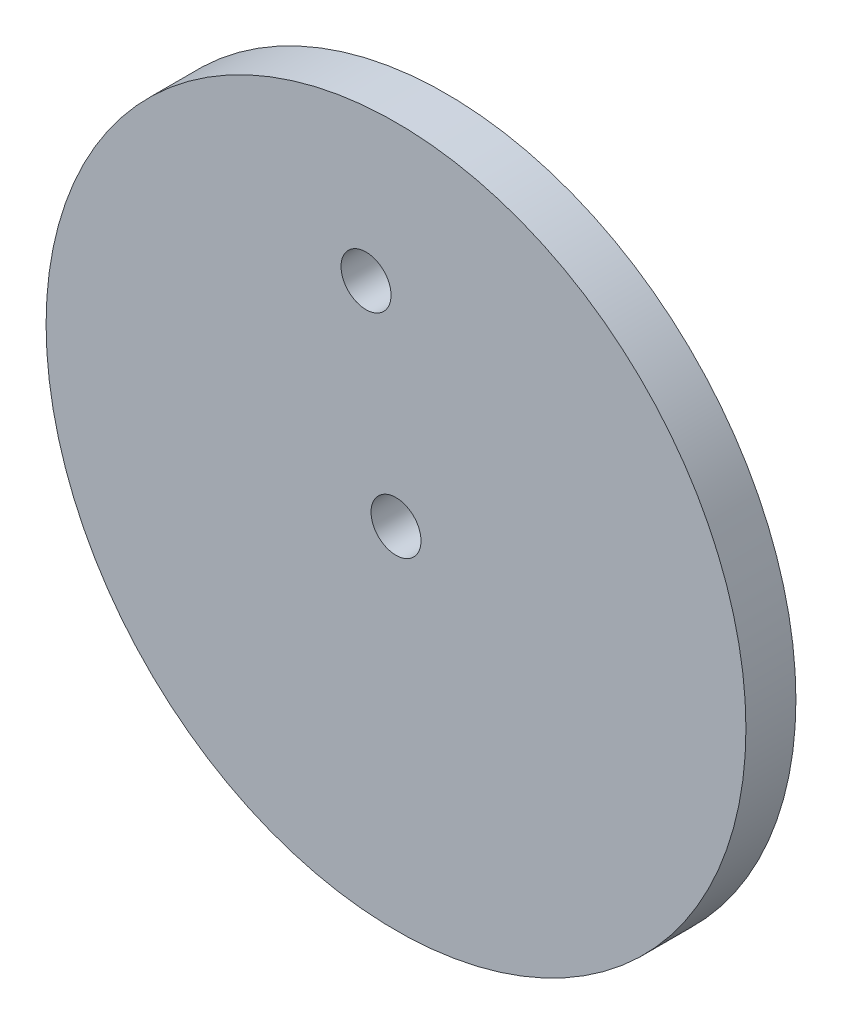
ISO-10303-21;
HEADER;
FILE_DESCRIPTION(('STEP AP214'),'2;1');
FILE_NAME('part.step','',(''),(''),'','','');
FILE_SCHEMA(('AUTOMOTIVE_DESIGN { 1 0 10303 214 1 1 1 1 }'));
ENDSEC;
DATA;
#1=APPLICATION_CONTEXT('core data for automotive mechanical design processes');
#2=APPLICATION_PROTOCOL_DEFINITION('international standard','automotive_design',2000,#1);
#3=PRODUCT_CONTEXT('',#1,'mechanical');
#4=PRODUCT('Part','Part','',(#3));
#5=PRODUCT_RELATED_PRODUCT_CATEGORY('part','',(#4));
#6=PRODUCT_DEFINITION_FORMATION('','',#4);
#7=PRODUCT_DEFINITION_CONTEXT('part definition',#1,'design');
#8=PRODUCT_DEFINITION('design','',#6,#7);
#9=PRODUCT_DEFINITION_SHAPE('','',#8);
#10=(LENGTH_UNIT() NAMED_UNIT(*) SI_UNIT(.MILLI.,.METRE.));
#11=(NAMED_UNIT(*) PLANE_ANGLE_UNIT() SI_UNIT($,.RADIAN.));
#12=(NAMED_UNIT(*) SI_UNIT($,.STERADIAN.) SOLID_ANGLE_UNIT());
#13=UNCERTAINTY_MEASURE_WITH_UNIT(LENGTH_MEASURE(1.E-05),#10,'distance_accuracy_value','');
#14=(GEOMETRIC_REPRESENTATION_CONTEXT(3) GLOBAL_UNCERTAINTY_ASSIGNED_CONTEXT((#13)) GLOBAL_UNIT_ASSIGNED_CONTEXT((#10,
#11,#12)) REPRESENTATION_CONTEXT('',''));
#15=CARTESIAN_POINT('',(0.,0.,0.));
#16=DIRECTION('',(0.,0.,1.));
#17=DIRECTION('',(1.,0.,0.));
#18=AXIS2_PLACEMENT_3D('',#15,#16,#17);
#19=CARTESIAN_POINT('',(0.,0.,3.175));
#20=DIRECTION('',(0.,0.,1.));
#21=DIRECTION('',(1.,0.,0.));
#22=AXIS2_PLACEMENT_3D('',#19,#20,#21);
#23=PLANE('',#22);
#24=CARTESIAN_POINT('',(0.,0.,3.175));
#25=DIRECTION('',(0.,0.,1.));
#26=DIRECTION('',(1.,0.,0.));
#27=AXIS2_PLACEMENT_3D('',#24,#25,#26);
#28=CIRCLE('',#27,1.5875);
#29=CARTESIAN_POINT('',(1.5875,0.,3.175));
#30=VERTEX_POINT('',#29);
#31=EDGE_CURVE('E44',#30,#30,#28,.T.);
#32=ORIENTED_EDGE('',*,*,#31,.F.);
#33=EDGE_LOOP('',(#32));
#34=FACE_BOUND('',#33,.T.);
#35=CARTESIAN_POINT('',(0.,0.,3.175));
#36=DIRECTION('',(0.,0.,1.));
#37=DIRECTION('',(1.,0.,0.));
#38=AXIS2_PLACEMENT_3D('',#35,#36,#37);
#39=CIRCLE('',#38,22.225);
#40=CARTESIAN_POINT('',(22.225,0.,3.175));
#41=VERTEX_POINT('',#40);
#42=EDGE_CURVE('E10',#41,#41,#39,.T.);
#43=ORIENTED_EDGE('',*,*,#42,.T.);
#44=EDGE_LOOP('',(#43));
#45=FACE_BOUND('',#44,.T.);
#46=CARTESIAN_POINT('',(-1.90394247561181,12.5564725559992,3.175));
#47=DIRECTION('',(0.,0.,1.));
#48=DIRECTION('',(1.,0.,0.));
#49=AXIS2_PLACEMENT_3D('',#46,#47,#48);
#50=CIRCLE('',#49,1.5875);
#51=CARTESIAN_POINT('',(-0.316442475611814,12.5564725559992,3.175));
#52=VERTEX_POINT('',#51);
#53=EDGE_CURVE('E49',#52,#52,#50,.T.);
#54=ORIENTED_EDGE('',*,*,#53,.F.);
#55=EDGE_LOOP('',(#54));
#56=FACE_BOUND('',#55,.T.);
#57=ADVANCED_FACE('F33',(#34,#45,#56),#23,.T.);
#58=CARTESIAN_POINT('',(0.,0.,0.));
#59=DIRECTION('',(0.,0.,1.));
#60=DIRECTION('',(1.,0.,0.));
#61=AXIS2_PLACEMENT_3D('',#58,#59,#60);
#62=PLANE('',#61);
#63=CARTESIAN_POINT('',(0.,0.,0.));
#64=DIRECTION('',(0.,0.,1.));
#65=DIRECTION('',(1.,0.,0.));
#66=AXIS2_PLACEMENT_3D('',#63,#64,#65);
#67=CIRCLE('',#66,22.225);
#68=CARTESIAN_POINT('',(22.225,0.,0.));
#69=VERTEX_POINT('',#68);
#70=EDGE_CURVE('E37',#69,#69,#67,.T.);
#71=ORIENTED_EDGE('',*,*,#70,.F.);
#72=EDGE_LOOP('',(#71));
#73=FACE_BOUND('',#72,.T.);
#74=CARTESIAN_POINT('',(0.,0.,0.));
#75=DIRECTION('',(0.,0.,1.));
#76=DIRECTION('',(1.,0.,0.));
#77=AXIS2_PLACEMENT_3D('',#74,#75,#76);
#78=CIRCLE('',#77,1.5875);
#79=CARTESIAN_POINT('',(1.5875,0.,0.));
#80=VERTEX_POINT('',#79);
#81=EDGE_CURVE('E46',#80,#80,#78,.T.);
#82=ORIENTED_EDGE('',*,*,#81,.T.);
#83=EDGE_LOOP('',(#82));
#84=FACE_BOUND('',#83,.T.);
#85=CARTESIAN_POINT('',(-1.90394247561181,12.5564725559992,0.));
#86=DIRECTION('',(0.,0.,1.));
#87=DIRECTION('',(1.,0.,0.));
#88=AXIS2_PLACEMENT_3D('',#85,#86,#87);
#89=CIRCLE('',#88,1.5875);
#90=CARTESIAN_POINT('',(-0.316442475611814,12.5564725559992,0.));
#91=VERTEX_POINT('',#90);
#92=EDGE_CURVE('E52',#91,#91,#89,.T.);
#93=ORIENTED_EDGE('',*,*,#92,.T.);
#94=EDGE_LOOP('',(#93));
#95=FACE_BOUND('',#94,.T.);
#96=ADVANCED_FACE('F62',(#73,#84,#95),#62,.F.);
#97=CARTESIAN_POINT('',(0.,0.,3.175));
#98=DIRECTION('',(0.,0.,-1.));
#99=DIRECTION('',(-1.,0.,0.));
#100=AXIS2_PLACEMENT_3D('',#97,#98,#99);
#101=CYLINDRICAL_SURFACE('',#100,22.225);
#102=ORIENTED_EDGE('',*,*,#42,.F.);
#103=EDGE_LOOP('',(#102));
#104=FACE_BOUND('',#103,.T.);
#105=ORIENTED_EDGE('',*,*,#70,.T.);
#106=EDGE_LOOP('',(#105));
#107=FACE_BOUND('',#106,.T.);
#108=ADVANCED_FACE('F35',(#104,#107),#101,.T.);
#109=CARTESIAN_POINT('',(0.,0.,3.175));
#110=DIRECTION('',(0.,0.,-1.));
#111=DIRECTION('',(-1.,0.,0.));
#112=AXIS2_PLACEMENT_3D('',#109,#110,#111);
#113=CYLINDRICAL_SURFACE('',#112,1.5875);
#114=ORIENTED_EDGE('',*,*,#31,.T.);
#115=EDGE_LOOP('',(#114));
#116=FACE_BOUND('',#115,.T.);
#117=ORIENTED_EDGE('',*,*,#81,.F.);
#118=EDGE_LOOP('',(#117));
#119=FACE_BOUND('',#118,.T.);
#120=ADVANCED_FACE('F71',(#116,#119),#113,.F.);
#121=CARTESIAN_POINT('',(-1.90394247561181,12.5564725559992,3.175));
#122=DIRECTION('',(0.,0.,-1.));
#123=DIRECTION('',(-1.,0.,0.));
#124=AXIS2_PLACEMENT_3D('',#121,#122,#123);
#125=CYLINDRICAL_SURFACE('',#124,1.5875);
#126=ORIENTED_EDGE('',*,*,#53,.T.);
#127=EDGE_LOOP('',(#126));
#128=FACE_BOUND('',#127,.T.);
#129=ORIENTED_EDGE('',*,*,#92,.F.);
#130=EDGE_LOOP('',(#129));
#131=FACE_BOUND('',#130,.T.);
#132=ADVANCED_FACE('F58',(#128,#131),#125,.F.);
#133=CLOSED_SHELL('',(#57,#96,#108,#120,#132));
#134=MANIFOLD_SOLID_BREP('B2',#133);
#135=ADVANCED_BREP_SHAPE_REPRESENTATION('',(#18,#134),#14);
#136=SHAPE_DEFINITION_REPRESENTATION(#9,#135);
ENDSEC;
END-ISO-10303-21;
